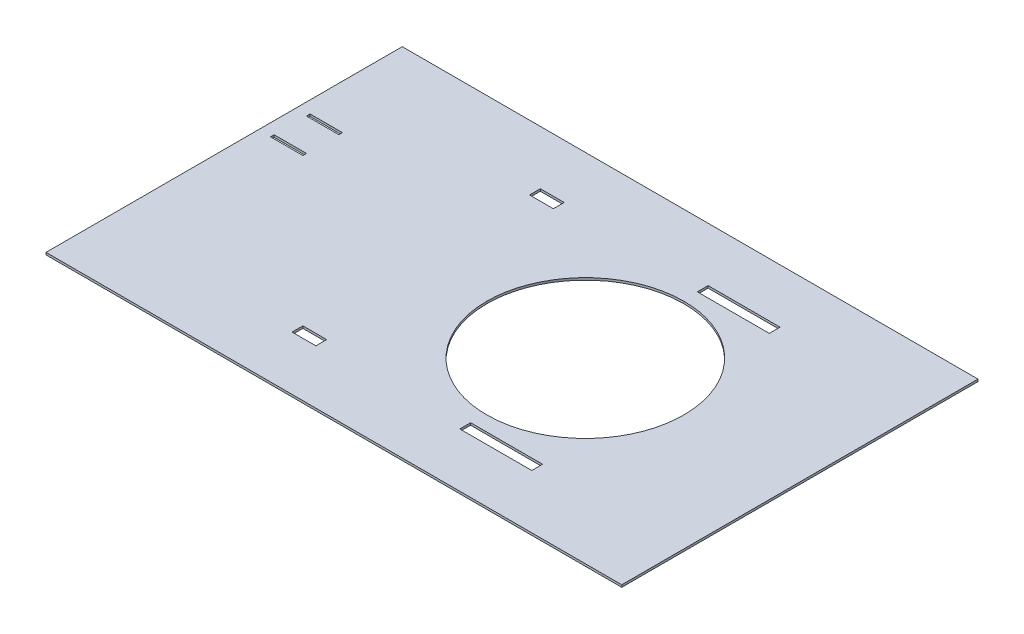
ISO-10303-21;
HEADER;
FILE_DESCRIPTION(('STEP AP214'),'2;1');
FILE_NAME('part.step','',(''),(''),'','','');
FILE_SCHEMA(('AUTOMOTIVE_DESIGN { 1 0 10303 214 1 1 1 1 }'));
ENDSEC;
DATA;
#1=APPLICATION_CONTEXT('core data for automotive mechanical design processes');
#2=APPLICATION_PROTOCOL_DEFINITION('international standard','automotive_design',2000,#1);
#3=PRODUCT_CONTEXT('',#1,'mechanical');
#4=PRODUCT('Part','Part','',(#3));
#5=PRODUCT_RELATED_PRODUCT_CATEGORY('part','',(#4));
#6=PRODUCT_DEFINITION_FORMATION('','',#4);
#7=PRODUCT_DEFINITION_CONTEXT('part definition',#1,'design');
#8=PRODUCT_DEFINITION('design','',#6,#7);
#9=PRODUCT_DEFINITION_SHAPE('','',#8);
#10=(LENGTH_UNIT() NAMED_UNIT(*) SI_UNIT(.MILLI.,.METRE.));
#11=(NAMED_UNIT(*) PLANE_ANGLE_UNIT() SI_UNIT($,.RADIAN.));
#12=(NAMED_UNIT(*) SI_UNIT($,.STERADIAN.) SOLID_ANGLE_UNIT());
#13=UNCERTAINTY_MEASURE_WITH_UNIT(LENGTH_MEASURE(1.E-05),#10,'distance_accuracy_value','');
#14=(GEOMETRIC_REPRESENTATION_CONTEXT(3) GLOBAL_UNCERTAINTY_ASSIGNED_CONTEXT((#13)) GLOBAL_UNIT_ASSIGNED_CONTEXT((#10,
#11,#12)) REPRESENTATION_CONTEXT('',''));
#15=CARTESIAN_POINT('',(0.,0.,0.));
#16=DIRECTION('',(0.,0.,1.));
#17=DIRECTION('',(1.,0.,0.));
#18=AXIS2_PLACEMENT_3D('',#15,#16,#17);
#19=CARTESIAN_POINT('',(0.,3.,0.));
#20=DIRECTION('',(0.,1.,0.));
#21=DIRECTION('',(0.,0.,1.));
#22=AXIS2_PLACEMENT_3D('',#19,#20,#21);
#23=PLANE('',#22);
#24=DIRECTION('',(1.,0.,0.));
#25=VECTOR('',#24,1.);
#26=CARTESIAN_POINT('',(-387.20375,3.,239.5806));
#27=LINE('',#26,#25);
#28=CARTESIAN_POINT('',(-387.20375,3.,239.5806));
#29=VERTEX_POINT('',#28);
#30=CARTESIAN_POINT('',(387.20375,3.,239.5806));
#31=VERTEX_POINT('',#30);
#32=EDGE_CURVE('E502',#29,#31,#27,.T.);
#33=ORIENTED_EDGE('',*,*,#32,.T.);
#34=DIRECTION('',(0.,0.,-1.));
#35=VECTOR('',#34,1.);
#36=CARTESIAN_POINT('',(387.20375,3.,239.5806));
#37=LINE('',#36,#35);
#38=CARTESIAN_POINT('',(387.20375,3.,-239.5806));
#39=VERTEX_POINT('',#38);
#40=EDGE_CURVE('E515',#31,#39,#37,.T.);
#41=ORIENTED_EDGE('',*,*,#40,.T.);
#42=DIRECTION('',(-1.,0.,0.));
#43=VECTOR('',#42,1.);
#44=CARTESIAN_POINT('',(387.20375,3.,-239.5806));
#45=LINE('',#44,#43);
#46=CARTESIAN_POINT('',(-387.20375,3.,-239.5806));
#47=VERTEX_POINT('',#46);
#48=EDGE_CURVE('E496',#39,#47,#45,.T.);
#49=ORIENTED_EDGE('',*,*,#48,.T.);
#50=DIRECTION('',(0.,0.,1.));
#51=VECTOR('',#50,1.);
#52=CARTESIAN_POINT('',(-387.20375,3.,-239.5806));
#53=LINE('',#52,#51);
#54=EDGE_CURVE('E509',#47,#29,#53,.T.);
#55=ORIENTED_EDGE('',*,*,#54,.T.);
#56=EDGE_LOOP('',(#33,#41,#49,#55));
#57=FACE_BOUND('',#56,.T.);
#58=CARTESIAN_POINT('',(98.6407500000001,3.,-132.5042));
#59=CARTESIAN_POINT('',(25.46305,3.,-132.5043));
#60=CARTESIAN_POINT('',(-33.85925,3.,-73.1822));
#61=CARTESIAN_POINT('',(-33.8594499999999,3.,-0.00450000000001838));
#62=B_SPLINE_CURVE_WITH_KNOTS('',3,(#58,#59,#60,#61),.UNSPECIFIED.,.F.,.F.,(4,4),(0.2,0.4),.UNSPECIFIED.);
#63=CARTESIAN_POINT('',(98.6407500000001,3.,-132.5042));
#64=VERTEX_POINT('',#63);
#65=CARTESIAN_POINT('',(-33.8594499999999,3.,-0.00450000000001838));
#66=VERTEX_POINT('',#65);
#67=EDGE_CURVE('E444',#64,#66,#62,.T.);
#68=ORIENTED_EDGE('',*,*,#67,.F.);
#69=CARTESIAN_POINT('',(231.14055,3.,-0.00419999245820923));
#70=CARTESIAN_POINT('',(231.14055,3.,-73.1819));
#71=CARTESIAN_POINT('',(171.81845,3.,-132.5041));
#72=CARTESIAN_POINT('',(98.6407500000001,3.,-132.5042));
#73=B_SPLINE_CURVE_WITH_KNOTS('',3,(#69,#70,#71,#72),.UNSPECIFIED.,.F.,.F.,(4,4),(0.,0.2),.UNSPECIFIED.);
#74=CARTESIAN_POINT('',(231.14055,3.,-0.00419999245820923));
#75=VERTEX_POINT('',#74);
#76=EDGE_CURVE('E439',#75,#64,#73,.T.);
#77=ORIENTED_EDGE('',*,*,#76,.F.);
#78=DIRECTION('',(0.,0.,-1.));
#79=VECTOR('',#78,1.);
#80=CARTESIAN_POINT('',(231.14055,3.,-0.00350000377091764));
#81=LINE('',#80,#79);
#82=CARTESIAN_POINT('',(231.14055,3.,-0.00350000377091764));
#83=VERTEX_POINT('',#82);
#84=EDGE_CURVE('E660',#83,#75,#81,.T.);
#85=ORIENTED_EDGE('',*,*,#84,.F.);
#86=CARTESIAN_POINT('',(98.6400500000001,3.,132.4958));
#87=CARTESIAN_POINT('',(171.81775,3.,132.4961));
#88=CARTESIAN_POINT('',(231.14015,3.,73.1742));
#89=CARTESIAN_POINT('',(231.14055,3.,-0.00350000377091764));
#90=B_SPLINE_CURVE_WITH_KNOTS('',3,(#86,#87,#88,#89),.UNSPECIFIED.,.F.,.F.,(4,4),(0.6,1.),.UNSPECIFIED.);
#91=CARTESIAN_POINT('',(98.6400500000001,3.,132.4958));
#92=VERTEX_POINT('',#91);
#93=EDGE_CURVE('E654',#92,#83,#90,.T.);
#94=ORIENTED_EDGE('',*,*,#93,.F.);
#95=CARTESIAN_POINT('',(-33.8594499999999,3.,-0.00450000000001838));
#96=CARTESIAN_POINT('',(-33.85965,3.,73.1731));
#97=CARTESIAN_POINT('',(25.46235,3.,132.4955));
#98=CARTESIAN_POINT('',(98.6400500000001,3.,132.4958));
#99=B_SPLINE_CURVE_WITH_KNOTS('',3,(#95,#96,#97,#98),.UNSPECIFIED.,.F.,.F.,(4,4),(0.4,0.6),.UNSPECIFIED.);
#100=EDGE_CURVE('E661',#66,#92,#99,.T.);
#101=ORIENTED_EDGE('',*,*,#100,.F.);
#102=EDGE_LOOP('',(#68,#77,#85,#94,#101));
#103=FACE_BOUND('',#102,.T.);
#104=DIRECTION('',(0.,0.,1.));
#105=VECTOR('',#104,1.);
#106=CARTESIAN_POINT('',(96.80135,3.,152.4554));
#107=LINE('',#106,#105);
#108=CARTESIAN_POINT('',(96.80135,3.,152.4554));
#109=VERTEX_POINT('',#108);
#110=CARTESIAN_POINT('',(96.80135,3.,166.9771));
#111=VERTEX_POINT('',#110);
#112=EDGE_CURVE('E410',#109,#111,#107,.T.);
#113=ORIENTED_EDGE('',*,*,#112,.F.);
#114=DIRECTION('',(-1.,0.,0.));
#115=VECTOR('',#114,1.);
#116=CARTESIAN_POINT('',(193.60275,3.,152.4554));
#117=LINE('',#116,#115);
#118=CARTESIAN_POINT('',(193.60275,3.,152.4554));
#119=VERTEX_POINT('',#118);
#120=EDGE_CURVE('E408',#119,#109,#117,.T.);
#121=ORIENTED_EDGE('',*,*,#120,.F.);
#122=DIRECTION('',(0.,0.,-1.));
#123=VECTOR('',#122,1.);
#124=CARTESIAN_POINT('',(193.60275,3.,166.9771));
#125=LINE('',#124,#123);
#126=CARTESIAN_POINT('',(193.60275,3.,166.9771));
#127=VERTEX_POINT('',#126);
#128=EDGE_CURVE('E416',#127,#119,#125,.T.);
#129=ORIENTED_EDGE('',*,*,#128,.F.);
#130=DIRECTION('',(1.,0.,0.));
#131=VECTOR('',#130,1.);
#132=CARTESIAN_POINT('',(96.80135,3.,166.9771));
#133=LINE('',#132,#131);
#134=EDGE_CURVE('E413',#111,#127,#133,.T.);
#135=ORIENTED_EDGE('',*,*,#134,.F.);
#136=EDGE_LOOP('',(#113,#121,#129,#135));
#137=FACE_BOUND('',#136,.T.);
#138=DIRECTION('',(0.,0.,1.));
#139=VECTOR('',#138,1.);
#140=CARTESIAN_POINT('',(-128.84775,3.,-166.9804));
#141=LINE('',#140,#139);
#142=CARTESIAN_POINT('',(-128.84775,3.,-166.9804));
#143=VERTEX_POINT('',#142);
#144=CARTESIAN_POINT('',(-128.84775,3.,-152.4587));
#145=VERTEX_POINT('',#144);
#146=EDGE_CURVE('E379',#143,#145,#141,.T.);
#147=ORIENTED_EDGE('',*,*,#146,.F.);
#148=DIRECTION('',(-1.,0.,0.));
#149=VECTOR('',#148,1.);
#150=CARTESIAN_POINT('',(-96.8046499999999,3.,-166.9804));
#151=LINE('',#150,#149);
#152=CARTESIAN_POINT('',(-96.8046499999999,3.,-166.9804));
#153=VERTEX_POINT('',#152);
#154=EDGE_CURVE('E377',#153,#143,#151,.T.);
#155=ORIENTED_EDGE('',*,*,#154,.F.);
#156=DIRECTION('',(0.,0.,-1.));
#157=VECTOR('',#156,1.);
#158=CARTESIAN_POINT('',(-96.8046499999999,3.,-152.4587));
#159=LINE('',#158,#157);
#160=CARTESIAN_POINT('',(-96.8046499999999,3.,-152.4587));
#161=VERTEX_POINT('',#160);
#162=EDGE_CURVE('E385',#161,#153,#159,.T.);
#163=ORIENTED_EDGE('',*,*,#162,.F.);
#164=DIRECTION('',(1.,0.,0.));
#165=VECTOR('',#164,1.);
#166=CARTESIAN_POINT('',(-128.84775,3.,-152.4587));
#167=LINE('',#166,#165);
#168=EDGE_CURVE('E382',#145,#161,#167,.T.);
#169=ORIENTED_EDGE('',*,*,#168,.F.);
#170=EDGE_LOOP('',(#147,#155,#163,#169));
#171=FACE_BOUND('',#170,.T.);
#172=DIRECTION('',(0.,0.,1.));
#173=VECTOR('',#172,1.);
#174=CARTESIAN_POINT('',(-128.84775,3.,152.4554));
#175=LINE('',#174,#173);
#176=CARTESIAN_POINT('',(-128.84775,3.,152.4554));
#177=VERTEX_POINT('',#176);
#178=CARTESIAN_POINT('',(-128.84775,3.,166.9771));
#179=VERTEX_POINT('',#178);
#180=EDGE_CURVE('E348',#177,#179,#175,.T.);
#181=ORIENTED_EDGE('',*,*,#180,.F.);
#182=DIRECTION('',(-1.,0.,0.));
#183=VECTOR('',#182,1.);
#184=CARTESIAN_POINT('',(-96.8046499999999,3.,152.4554));
#185=LINE('',#184,#183);
#186=CARTESIAN_POINT('',(-96.8046499999999,3.,152.4554));
#187=VERTEX_POINT('',#186);
#188=EDGE_CURVE('E346',#187,#177,#185,.T.);
#189=ORIENTED_EDGE('',*,*,#188,.F.);
#190=DIRECTION('',(0.,0.,-1.));
#191=VECTOR('',#190,1.);
#192=CARTESIAN_POINT('',(-96.8046499999999,3.,166.9771));
#193=LINE('',#192,#191);
#194=CARTESIAN_POINT('',(-96.8046499999999,3.,166.9771));
#195=VERTEX_POINT('',#194);
#196=EDGE_CURVE('E354',#195,#187,#193,.T.);
#197=ORIENTED_EDGE('',*,*,#196,.F.);
#198=DIRECTION('',(1.,0.,0.));
#199=VECTOR('',#198,1.);
#200=CARTESIAN_POINT('',(-128.84775,3.,166.9771));
#201=LINE('',#200,#199);
#202=EDGE_CURVE('E351',#179,#195,#201,.T.);
#203=ORIENTED_EDGE('',*,*,#202,.F.);
#204=EDGE_LOOP('',(#181,#189,#197,#203));
#205=FACE_BOUND('',#204,.T.);
#206=DIRECTION('',(0.,0.,1.));
#207=VECTOR('',#206,1.);
#208=CARTESIAN_POINT('',(-370.84615,3.,-99.2292));
#209=LINE('',#208,#207);
#210=CARTESIAN_POINT('',(-370.84615,3.,-99.2292));
#211=VERTEX_POINT('',#210);
#212=CARTESIAN_POINT('',(-370.84615,3.,-94.3886));
#213=VERTEX_POINT('',#212);
#214=EDGE_CURVE('E317',#211,#213,#209,.T.);
#215=ORIENTED_EDGE('',*,*,#214,.F.);
#216=DIRECTION('',(-1.,0.,0.));
#217=VECTOR('',#216,1.);
#218=CARTESIAN_POINT('',(-327.28105,3.,-99.2292));
#219=LINE('',#218,#217);
#220=CARTESIAN_POINT('',(-327.28105,3.,-99.2292));
#221=VERTEX_POINT('',#220);
#222=EDGE_CURVE('E315',#221,#211,#219,.T.);
#223=ORIENTED_EDGE('',*,*,#222,.F.);
#224=DIRECTION('',(0.,0.,-1.));
#225=VECTOR('',#224,1.);
#226=CARTESIAN_POINT('',(-327.28105,3.,-94.3886));
#227=LINE('',#226,#225);
#228=CARTESIAN_POINT('',(-327.28105,3.,-94.3886));
#229=VERTEX_POINT('',#228);
#230=EDGE_CURVE('E323',#229,#221,#227,.T.);
#231=ORIENTED_EDGE('',*,*,#230,.F.);
#232=DIRECTION('',(1.,0.,0.));
#233=VECTOR('',#232,1.);
#234=CARTESIAN_POINT('',(-370.84615,3.,-94.3886));
#235=LINE('',#234,#233);
#236=EDGE_CURVE('E320',#213,#229,#235,.T.);
#237=ORIENTED_EDGE('',*,*,#236,.F.);
#238=EDGE_LOOP('',(#215,#223,#231,#237));
#239=FACE_BOUND('',#238,.T.);
#240=DIRECTION('',(0.,0.,1.));
#241=VECTOR('',#240,1.);
#242=CARTESIAN_POINT('',(-370.84615,3.,-50.8235));
#243=LINE('',#242,#241);
#244=CARTESIAN_POINT('',(-370.84615,3.,-50.8235));
#245=VERTEX_POINT('',#244);
#246=CARTESIAN_POINT('',(-370.84615,3.,-45.9796));
#247=VERTEX_POINT('',#246);
#248=EDGE_CURVE('E286',#245,#247,#243,.T.);
#249=ORIENTED_EDGE('',*,*,#248,.F.);
#250=DIRECTION('',(-1.,0.,0.));
#251=VECTOR('',#250,1.);
#252=CARTESIAN_POINT('',(-327.28105,3.,-50.8235));
#253=LINE('',#252,#251);
#254=CARTESIAN_POINT('',(-327.28105,3.,-50.8235));
#255=VERTEX_POINT('',#254);
#256=EDGE_CURVE('E284',#255,#245,#253,.T.);
#257=ORIENTED_EDGE('',*,*,#256,.F.);
#258=DIRECTION('',(0.,0.,-1.));
#259=VECTOR('',#258,1.);
#260=CARTESIAN_POINT('',(-327.28105,3.,-45.9796));
#261=LINE('',#260,#259);
#262=CARTESIAN_POINT('',(-327.28105,3.,-45.9796));
#263=VERTEX_POINT('',#262);
#264=EDGE_CURVE('E292',#263,#255,#261,.T.);
#265=ORIENTED_EDGE('',*,*,#264,.F.);
#266=DIRECTION('',(1.,0.,0.));
#267=VECTOR('',#266,1.);
#268=CARTESIAN_POINT('',(-370.84615,3.,-45.9796));
#269=LINE('',#268,#267);
#270=EDGE_CURVE('E289',#247,#263,#269,.T.);
#271=ORIENTED_EDGE('',*,*,#270,.F.);
#272=EDGE_LOOP('',(#249,#257,#265,#271));
#273=FACE_BOUND('',#272,.T.);
#274=DIRECTION('',(0.,0.,-1.));
#275=VECTOR('',#274,1.);
#276=CARTESIAN_POINT('',(193.59605,3.,-152.4587));
#277=LINE('',#276,#275);
#278=CARTESIAN_POINT('',(193.59605,3.,-152.4587));
#279=VERTEX_POINT('',#278);
#280=CARTESIAN_POINT('',(193.59605,3.,-166.9804));
#281=VERTEX_POINT('',#280);
#282=EDGE_CURVE('E256',#279,#281,#277,.T.);
#283=ORIENTED_EDGE('',*,*,#282,.F.);
#284=DIRECTION('',(1.,0.,0.));
#285=VECTOR('',#284,1.);
#286=CARTESIAN_POINT('',(96.7963500000001,3.,-152.4587));
#287=LINE('',#286,#285);
#288=CARTESIAN_POINT('',(96.7963500000001,3.,-152.4587));
#289=VERTEX_POINT('',#288);
#290=EDGE_CURVE('E248',#289,#279,#287,.T.);
#291=ORIENTED_EDGE('',*,*,#290,.F.);
#292=DIRECTION('',(0.,0.,1.));
#293=VECTOR('',#292,1.);
#294=CARTESIAN_POINT('',(96.7963500000001,3.,-166.9804));
#295=LINE('',#294,#293);
#296=CARTESIAN_POINT('',(96.7963500000001,3.,-166.9804));
#297=VERTEX_POINT('',#296);
#298=EDGE_CURVE('E270',#297,#289,#295,.T.);
#299=ORIENTED_EDGE('',*,*,#298,.F.);
#300=DIRECTION('',(-1.,0.,0.));
#301=VECTOR('',#300,1.);
#302=CARTESIAN_POINT('',(193.59605,3.,-166.9804));
#303=LINE('',#302,#301);
#304=EDGE_CURVE('E268',#281,#297,#303,.T.);
#305=ORIENTED_EDGE('',*,*,#304,.F.);
#306=EDGE_LOOP('',(#283,#291,#299,#305));
#307=FACE_BOUND('',#306,.T.);
#308=ADVANCED_FACE('F33',(#57,#103,#137,#171,#205,#239,#273,#307),#23,.T.);
#309=CARTESIAN_POINT('',(0.,0.,0.));
#310=DIRECTION('',(0.,1.,0.));
#311=DIRECTION('',(0.,0.,1.));
#312=AXIS2_PLACEMENT_3D('',#309,#310,#311);
#313=PLANE('',#312);
#314=DIRECTION('',(-1.,0.,0.));
#315=VECTOR('',#314,1.);
#316=CARTESIAN_POINT('',(-327.28105,0.,-50.8235));
#317=LINE('',#316,#315);
#318=CARTESIAN_POINT('',(-327.28105,0.,-50.8235));
#319=VERTEX_POINT('',#318);
#320=CARTESIAN_POINT('',(-370.84615,0.,-50.8235));
#321=VERTEX_POINT('',#320);
#322=EDGE_CURVE('E264',#319,#321,#317,.T.);
#323=ORIENTED_EDGE('',*,*,#322,.T.);
#324=DIRECTION('',(0.,0.,1.));
#325=VECTOR('',#324,1.);
#326=CARTESIAN_POINT('',(-370.84615,0.,-50.8235));
#327=LINE('',#326,#325);
#328=CARTESIAN_POINT('',(-370.84615,0.,-45.9796));
#329=VERTEX_POINT('',#328);
#330=EDGE_CURVE('E297',#321,#329,#327,.T.);
#331=ORIENTED_EDGE('',*,*,#330,.T.);
#332=DIRECTION('',(1.,0.,0.));
#333=VECTOR('',#332,1.);
#334=CARTESIAN_POINT('',(-370.84615,0.,-45.9796));
#335=LINE('',#334,#333);
#336=CARTESIAN_POINT('',(-327.28105,0.,-45.9796));
#337=VERTEX_POINT('',#336);
#338=EDGE_CURVE('E300',#329,#337,#335,.T.);
#339=ORIENTED_EDGE('',*,*,#338,.T.);
#340=DIRECTION('',(0.,0.,-1.));
#341=VECTOR('',#340,1.);
#342=CARTESIAN_POINT('',(-327.28105,0.,-45.9796));
#343=LINE('',#342,#341);
#344=EDGE_CURVE('E287',#337,#319,#343,.T.);
#345=ORIENTED_EDGE('',*,*,#344,.T.);
#346=EDGE_LOOP('',(#323,#331,#339,#345));
#347=FACE_BOUND('',#346,.T.);
#348=DIRECTION('',(-1.,0.,0.));
#349=VECTOR('',#348,1.);
#350=CARTESIAN_POINT('',(-96.8046499999999,0.,152.4554));
#351=LINE('',#350,#349);
#352=CARTESIAN_POINT('',(-96.8046499999999,0.,152.4554));
#353=VERTEX_POINT('',#352);
#354=CARTESIAN_POINT('',(-128.84775,0.,152.4554));
#355=VERTEX_POINT('',#354);
#356=EDGE_CURVE('E345',#353,#355,#351,.T.);
#357=ORIENTED_EDGE('',*,*,#356,.T.);
#358=DIRECTION('',(0.,0.,1.));
#359=VECTOR('',#358,1.);
#360=CARTESIAN_POINT('',(-128.84775,0.,152.4554));
#361=LINE('',#360,#359);
#362=CARTESIAN_POINT('',(-128.84775,0.,166.9771));
#363=VERTEX_POINT('',#362);
#364=EDGE_CURVE('E359',#355,#363,#361,.T.);
#365=ORIENTED_EDGE('',*,*,#364,.T.);
#366=DIRECTION('',(1.,0.,0.));
#367=VECTOR('',#366,1.);
#368=CARTESIAN_POINT('',(-128.84775,0.,166.9771));
#369=LINE('',#368,#367);
#370=CARTESIAN_POINT('',(-96.8046499999999,0.,166.9771));
#371=VERTEX_POINT('',#370);
#372=EDGE_CURVE('E362',#363,#371,#369,.T.);
#373=ORIENTED_EDGE('',*,*,#372,.T.);
#374=DIRECTION('',(0.,0.,-1.));
#375=VECTOR('',#374,1.);
#376=CARTESIAN_POINT('',(-96.8046499999999,0.,166.9771));
#377=LINE('',#376,#375);
#378=EDGE_CURVE('E349',#371,#353,#377,.T.);
#379=ORIENTED_EDGE('',*,*,#378,.T.);
#380=EDGE_LOOP('',(#357,#365,#373,#379));
#381=FACE_BOUND('',#380,.T.);
#382=DIRECTION('',(-1.,0.,0.));
#383=VECTOR('',#382,1.);
#384=CARTESIAN_POINT('',(193.60275,0.,152.4554));
#385=LINE('',#384,#383);
#386=CARTESIAN_POINT('',(193.60275,0.,152.4554));
#387=VERTEX_POINT('',#386);
#388=CARTESIAN_POINT('',(96.80135,0.,152.4554));
#389=VERTEX_POINT('',#388);
#390=EDGE_CURVE('E407',#387,#389,#385,.T.);
#391=ORIENTED_EDGE('',*,*,#390,.T.);
#392=DIRECTION('',(0.,0.,1.));
#393=VECTOR('',#392,1.);
#394=CARTESIAN_POINT('',(96.80135,0.,152.4554));
#395=LINE('',#394,#393);
#396=CARTESIAN_POINT('',(96.80135,0.,166.9771));
#397=VERTEX_POINT('',#396);
#398=EDGE_CURVE('E421',#389,#397,#395,.T.);
#399=ORIENTED_EDGE('',*,*,#398,.T.);
#400=DIRECTION('',(1.,0.,0.));
#401=VECTOR('',#400,1.);
#402=CARTESIAN_POINT('',(96.80135,0.,166.9771));
#403=LINE('',#402,#401);
#404=CARTESIAN_POINT('',(193.60275,0.,166.9771));
#405=VERTEX_POINT('',#404);
#406=EDGE_CURVE('E424',#397,#405,#403,.T.);
#407=ORIENTED_EDGE('',*,*,#406,.T.);
#408=DIRECTION('',(0.,0.,-1.));
#409=VECTOR('',#408,1.);
#410=CARTESIAN_POINT('',(193.60275,0.,166.9771));
#411=LINE('',#410,#409);
#412=EDGE_CURVE('E411',#405,#387,#411,.T.);
#413=ORIENTED_EDGE('',*,*,#412,.T.);
#414=EDGE_LOOP('',(#391,#399,#407,#413));
#415=FACE_BOUND('',#414,.T.);
#416=DIRECTION('',(1.,0.,0.));
#417=VECTOR('',#416,1.);
#418=CARTESIAN_POINT('',(-387.20375,0.,239.5806));
#419=LINE('',#418,#417);
#420=CARTESIAN_POINT('',(-387.20375,0.,239.5806));
#421=VERTEX_POINT('',#420);
#422=CARTESIAN_POINT('',(387.20375,0.,239.5806));
#423=VERTEX_POINT('',#422);
#424=EDGE_CURVE('E492',#421,#423,#419,.T.);
#425=ORIENTED_EDGE('',*,*,#424,.F.);
#426=DIRECTION('',(0.,0.,1.));
#427=VECTOR('',#426,1.);
#428=CARTESIAN_POINT('',(-387.20375,0.,-239.5806));
#429=LINE('',#428,#427);
#430=CARTESIAN_POINT('',(-387.20375,0.,-239.5806));
#431=VERTEX_POINT('',#430);
#432=EDGE_CURVE('E500',#431,#421,#429,.T.);
#433=ORIENTED_EDGE('',*,*,#432,.F.);
#434=DIRECTION('',(-1.,0.,0.));
#435=VECTOR('',#434,1.);
#436=CARTESIAN_POINT('',(387.20375,0.,-239.5806));
#437=LINE('',#436,#435);
#438=CARTESIAN_POINT('',(387.20375,0.,-239.5806));
#439=VERTEX_POINT('',#438);
#440=EDGE_CURVE('E491',#439,#431,#437,.T.);
#441=ORIENTED_EDGE('',*,*,#440,.F.);
#442=DIRECTION('',(0.,0.,-1.));
#443=VECTOR('',#442,1.);
#444=CARTESIAN_POINT('',(387.20375,0.,239.5806));
#445=LINE('',#444,#443);
#446=EDGE_CURVE('E483',#423,#439,#445,.T.);
#447=ORIENTED_EDGE('',*,*,#446,.F.);
#448=EDGE_LOOP('',(#425,#433,#441,#447));
#449=FACE_BOUND('',#448,.T.);
#450=CARTESIAN_POINT('',(231.14055,0.,-0.00419999245820923));
#451=CARTESIAN_POINT('',(231.14055,0.,-73.1819));
#452=CARTESIAN_POINT('',(171.81845,0.,-132.5041));
#453=CARTESIAN_POINT('',(98.6407500000001,0.,-132.5042));
#454=B_SPLINE_CURVE_WITH_KNOTS('',3,(#450,#451,#452,#453),.UNSPECIFIED.,.F.,.F.,(4,4),(0.,0.2),.UNSPECIFIED.);
#455=CARTESIAN_POINT('',(231.14055,0.,-0.00419999245820923));
#456=VERTEX_POINT('',#455);
#457=CARTESIAN_POINT('',(98.6407500000001,0.,-132.5042));
#458=VERTEX_POINT('',#457);
#459=EDGE_CURVE('E438',#456,#458,#454,.T.);
#460=ORIENTED_EDGE('',*,*,#459,.T.);
#461=CARTESIAN_POINT('',(98.6407500000001,0.,-132.5042));
#462=CARTESIAN_POINT('',(25.46305,0.,-132.5043));
#463=CARTESIAN_POINT('',(-33.85925,0.,-73.1822));
#464=CARTESIAN_POINT('',(-33.8594499999999,0.,-0.00450000000001838));
#465=B_SPLINE_CURVE_WITH_KNOTS('',3,(#461,#462,#463,#464),.UNSPECIFIED.,.F.,.F.,(4,4),(0.2,0.4),.UNSPECIFIED.);
#466=CARTESIAN_POINT('',(-33.8594499999999,0.,-0.00450000000001838));
#467=VERTEX_POINT('',#466);
#468=EDGE_CURVE('E673',#458,#467,#465,.T.);
#469=ORIENTED_EDGE('',*,*,#468,.T.);
#470=CARTESIAN_POINT('',(-33.8594499999999,0.,-0.00450000000001838));
#471=CARTESIAN_POINT('',(-33.85965,0.,73.1731));
#472=CARTESIAN_POINT('',(25.46235,0.,132.4955));
#473=CARTESIAN_POINT('',(98.6400500000001,0.,132.4958));
#474=B_SPLINE_CURVE_WITH_KNOTS('',3,(#470,#471,#472,#473),.UNSPECIFIED.,.F.,.F.,(4,4),(0.4,0.6),.UNSPECIFIED.);
#475=CARTESIAN_POINT('',(98.6400500000001,0.,132.4958));
#476=VERTEX_POINT('',#475);
#477=EDGE_CURVE('E681',#467,#476,#474,.T.);
#478=ORIENTED_EDGE('',*,*,#477,.T.);
#479=CARTESIAN_POINT('',(98.6400500000001,0.,132.4958));
#480=CARTESIAN_POINT('',(171.81775,0.,132.4961));
#481=CARTESIAN_POINT('',(231.14015,0.,73.1742));
#482=CARTESIAN_POINT('',(231.14055,0.,-0.00350000377091764));
#483=B_SPLINE_CURVE_WITH_KNOTS('',3,(#479,#480,#481,#482),.UNSPECIFIED.,.F.,.F.,(4,4),(0.6,1.),.UNSPECIFIED.);
#484=CARTESIAN_POINT('',(231.14055,0.,-0.00350000377091764));
#485=VERTEX_POINT('',#484);
#486=EDGE_CURVE('E689',#476,#485,#483,.T.);
#487=ORIENTED_EDGE('',*,*,#486,.T.);
#488=DIRECTION('',(0.,0.,-1.));
#489=VECTOR('',#488,1.);
#490=CARTESIAN_POINT('',(231.14055,0.,-0.00350000377091764));
#491=LINE('',#490,#489);
#492=EDGE_CURVE('E445',#485,#456,#491,.T.);
#493=ORIENTED_EDGE('',*,*,#492,.T.);
#494=EDGE_LOOP('',(#460,#469,#478,#487,#493));
#495=FACE_BOUND('',#494,.T.);
#496=DIRECTION('',(-1.,0.,0.));
#497=VECTOR('',#496,1.);
#498=CARTESIAN_POINT('',(-96.8046499999999,0.,-166.9804));
#499=LINE('',#498,#497);
#500=CARTESIAN_POINT('',(-96.8046499999999,0.,-166.9804));
#501=VERTEX_POINT('',#500);
#502=CARTESIAN_POINT('',(-128.84775,0.,-166.9804));
#503=VERTEX_POINT('',#502);
#504=EDGE_CURVE('E376',#501,#503,#499,.T.);
#505=ORIENTED_EDGE('',*,*,#504,.T.);
#506=DIRECTION('',(0.,0.,1.));
#507=VECTOR('',#506,1.);
#508=CARTESIAN_POINT('',(-128.84775,0.,-166.9804));
#509=LINE('',#508,#507);
#510=CARTESIAN_POINT('',(-128.84775,0.,-152.4587));
#511=VERTEX_POINT('',#510);
#512=EDGE_CURVE('E390',#503,#511,#509,.T.);
#513=ORIENTED_EDGE('',*,*,#512,.T.);
#514=DIRECTION('',(1.,0.,0.));
#515=VECTOR('',#514,1.);
#516=CARTESIAN_POINT('',(-128.84775,0.,-152.4587));
#517=LINE('',#516,#515);
#518=CARTESIAN_POINT('',(-96.8046499999999,0.,-152.4587));
#519=VERTEX_POINT('',#518);
#520=EDGE_CURVE('E393',#511,#519,#517,.T.);
#521=ORIENTED_EDGE('',*,*,#520,.T.);
#522=DIRECTION('',(0.,0.,-1.));
#523=VECTOR('',#522,1.);
#524=CARTESIAN_POINT('',(-96.8046499999999,0.,-152.4587));
#525=LINE('',#524,#523);
#526=EDGE_CURVE('E380',#519,#501,#525,.T.);
#527=ORIENTED_EDGE('',*,*,#526,.T.);
#528=EDGE_LOOP('',(#505,#513,#521,#527));
#529=FACE_BOUND('',#528,.T.);
#530=DIRECTION('',(-1.,0.,0.));
#531=VECTOR('',#530,1.);
#532=CARTESIAN_POINT('',(-327.28105,0.,-99.2292));
#533=LINE('',#532,#531);
#534=CARTESIAN_POINT('',(-327.28105,0.,-99.2292));
#535=VERTEX_POINT('',#534);
#536=CARTESIAN_POINT('',(-370.84615,0.,-99.2292));
#537=VERTEX_POINT('',#536);
#538=EDGE_CURVE('E314',#535,#537,#533,.T.);
#539=ORIENTED_EDGE('',*,*,#538,.T.);
#540=DIRECTION('',(0.,0.,1.));
#541=VECTOR('',#540,1.);
#542=CARTESIAN_POINT('',(-370.84615,0.,-99.2292));
#543=LINE('',#542,#541);
#544=CARTESIAN_POINT('',(-370.84615,0.,-94.3886));
#545=VERTEX_POINT('',#544);
#546=EDGE_CURVE('E328',#537,#545,#543,.T.);
#547=ORIENTED_EDGE('',*,*,#546,.T.);
#548=DIRECTION('',(1.,0.,0.));
#549=VECTOR('',#548,1.);
#550=CARTESIAN_POINT('',(-370.84615,0.,-94.3886));
#551=LINE('',#550,#549);
#552=CARTESIAN_POINT('',(-327.28105,0.,-94.3886));
#553=VERTEX_POINT('',#552);
#554=EDGE_CURVE('E331',#545,#553,#551,.T.);
#555=ORIENTED_EDGE('',*,*,#554,.T.);
#556=DIRECTION('',(0.,0.,-1.));
#557=VECTOR('',#556,1.);
#558=CARTESIAN_POINT('',(-327.28105,0.,-94.3886));
#559=LINE('',#558,#557);
#560=EDGE_CURVE('E318',#553,#535,#559,.T.);
#561=ORIENTED_EDGE('',*,*,#560,.T.);
#562=EDGE_LOOP('',(#539,#547,#555,#561));
#563=FACE_BOUND('',#562,.T.);
#564=DIRECTION('',(1.,0.,0.));
#565=VECTOR('',#564,1.);
#566=CARTESIAN_POINT('',(96.7963500000001,0.,-152.4587));
#567=LINE('',#566,#565);
#568=CARTESIAN_POINT('',(96.7963500000001,0.,-152.4587));
#569=VERTEX_POINT('',#568);
#570=CARTESIAN_POINT('',(193.59605,0.,-152.4587));
#571=VERTEX_POINT('',#570);
#572=EDGE_CURVE('E56',#569,#571,#567,.T.);
#573=ORIENTED_EDGE('',*,*,#572,.T.);
#574=DIRECTION('',(0.,0.,-1.));
#575=VECTOR('',#574,1.);
#576=CARTESIAN_POINT('',(193.59605,0.,-152.4587));
#577=LINE('',#576,#575);
#578=CARTESIAN_POINT('',(193.59605,0.,-166.9804));
#579=VERTEX_POINT('',#578);
#580=EDGE_CURVE('E263',#571,#579,#577,.T.);
#581=ORIENTED_EDGE('',*,*,#580,.T.);
#582=DIRECTION('',(-1.,0.,0.));
#583=VECTOR('',#582,1.);
#584=CARTESIAN_POINT('',(193.59605,0.,-166.9804));
#585=LINE('',#584,#583);
#586=CARTESIAN_POINT('',(96.7963500000001,0.,-166.9804));
#587=VERTEX_POINT('',#586);
#588=EDGE_CURVE('E276',#579,#587,#585,.T.);
#589=ORIENTED_EDGE('',*,*,#588,.T.);
#590=DIRECTION('',(0.,0.,1.));
#591=VECTOR('',#590,1.);
#592=CARTESIAN_POINT('',(96.7963500000001,0.,-166.9804));
#593=LINE('',#592,#591);
#594=EDGE_CURVE('E257',#587,#569,#593,.T.);
#595=ORIENTED_EDGE('',*,*,#594,.T.);
#596=EDGE_LOOP('',(#573,#581,#589,#595));
#597=FACE_BOUND('',#596,.T.);
#598=ADVANCED_FACE('F464',(#347,#381,#415,#449,#495,#529,#563,#597),#313,.F.);
#599=CARTESIAN_POINT('',(-387.20375,3.,239.5806));
#600=DIRECTION('',(0.,0.,-1.));
#601=DIRECTION('',(-1.,0.,0.));
#602=AXIS2_PLACEMENT_3D('',#599,#600,#601);
#603=PLANE('',#602);
#604=ORIENTED_EDGE('',*,*,#424,.T.);
#605=DIRECTION('',(0.,-1.,0.));
#606=VECTOR('',#605,1.);
#607=CARTESIAN_POINT('',(387.20375,3.,239.5806));
#608=LINE('',#607,#606);
#609=EDGE_CURVE('E11',#31,#423,#608,.T.);
#610=ORIENTED_EDGE('',*,*,#609,.F.);
#611=ORIENTED_EDGE('',*,*,#32,.F.);
#612=DIRECTION('',(0.,-1.,0.));
#613=VECTOR('',#612,1.);
#614=CARTESIAN_POINT('',(-387.20375,3.,239.5806));
#615=LINE('',#614,#613);
#616=EDGE_CURVE('E506',#29,#421,#615,.T.);
#617=ORIENTED_EDGE('',*,*,#616,.T.);
#618=EDGE_LOOP('',(#604,#610,#611,#617));
#619=FACE_BOUND('',#618,.T.);
#620=ADVANCED_FACE('F35',(#619),#603,.F.);
#621=CARTESIAN_POINT('',(387.20375,3.,239.5806));
#622=DIRECTION('',(-1.,0.,0.));
#623=DIRECTION('',(0.,0.,1.));
#624=AXIS2_PLACEMENT_3D('',#621,#622,#623);
#625=PLANE('',#624);
#626=ORIENTED_EDGE('',*,*,#446,.T.);
#627=DIRECTION('',(0.,-1.,0.));
#628=VECTOR('',#627,1.);
#629=CARTESIAN_POINT('',(387.20375,3.,-239.5806));
#630=LINE('',#629,#628);
#631=EDGE_CURVE('E41',#39,#439,#630,.T.);
#632=ORIENTED_EDGE('',*,*,#631,.F.);
#633=ORIENTED_EDGE('',*,*,#40,.F.);
#634=ORIENTED_EDGE('',*,*,#609,.T.);
#635=EDGE_LOOP('',(#626,#632,#633,#634));
#636=FACE_BOUND('',#635,.T.);
#637=ADVANCED_FACE('F474',(#636),#625,.F.);
#638=CARTESIAN_POINT('',(387.20375,3.,-239.5806));
#639=DIRECTION('',(0.,0.,1.));
#640=DIRECTION('',(1.,0.,0.));
#641=AXIS2_PLACEMENT_3D('',#638,#639,#640);
#642=PLANE('',#641);
#643=ORIENTED_EDGE('',*,*,#440,.T.);
#644=DIRECTION('',(0.,-1.,0.));
#645=VECTOR('',#644,1.);
#646=CARTESIAN_POINT('',(-387.20375,3.,-239.5806));
#647=LINE('',#646,#645);
#648=EDGE_CURVE('E497',#47,#431,#647,.T.);
#649=ORIENTED_EDGE('',*,*,#648,.F.);
#650=ORIENTED_EDGE('',*,*,#48,.F.);
#651=ORIENTED_EDGE('',*,*,#631,.T.);
#652=EDGE_LOOP('',(#643,#649,#650,#651));
#653=FACE_BOUND('',#652,.T.);
#654=ADVANCED_FACE('F471',(#653),#642,.F.);
#655=CARTESIAN_POINT('',(-387.20375,3.,-239.5806));
#656=DIRECTION('',(1.,0.,0.));
#657=DIRECTION('',(0.,0.,-1.));
#658=AXIS2_PLACEMENT_3D('',#655,#656,#657);
#659=PLANE('',#658);
#660=ORIENTED_EDGE('',*,*,#432,.T.);
#661=ORIENTED_EDGE('',*,*,#616,.F.);
#662=ORIENTED_EDGE('',*,*,#54,.F.);
#663=ORIENTED_EDGE('',*,*,#648,.T.);
#664=EDGE_LOOP('',(#660,#661,#662,#663));
#665=FACE_BOUND('',#664,.T.);
#666=ADVANCED_FACE('F459',(#665),#659,.F.);
#667=DIRECTION('',(0.,-1.,0.));
#668=VECTOR('',#667,1.);
#669=SURFACE_OF_LINEAR_EXTRUSION('',#73,#668);
#670=ORIENTED_EDGE('',*,*,#459,.F.);
#671=DIRECTION('',(0.,-1.,0.));
#672=VECTOR('',#671,1.);
#673=CARTESIAN_POINT('',(231.14055,3.,-0.00419999245820923));
#674=LINE('',#673,#672);
#675=EDGE_CURVE('E669',#75,#456,#674,.T.);
#676=ORIENTED_EDGE('',*,*,#675,.F.);
#677=ORIENTED_EDGE('',*,*,#76,.T.);
#678=DIRECTION('',(0.,-1.,0.));
#679=VECTOR('',#678,1.);
#680=CARTESIAN_POINT('',(98.6407500000001,3.,-132.5042));
#681=LINE('',#680,#679);
#682=EDGE_CURVE('E518',#64,#458,#681,.T.);
#683=ORIENTED_EDGE('',*,*,#682,.T.);
#684=EDGE_LOOP('',(#670,#676,#677,#683));
#685=FACE_BOUND('',#684,.T.);
#686=ADVANCED_FACE('F454',(#685),#669,.T.);
#687=DIRECTION('',(0.,-1.,0.));
#688=VECTOR('',#687,1.);
#689=SURFACE_OF_LINEAR_EXTRUSION('',#62,#688);
#690=ORIENTED_EDGE('',*,*,#468,.F.);
#691=ORIENTED_EDGE('',*,*,#682,.F.);
#692=ORIENTED_EDGE('',*,*,#67,.T.);
#693=DIRECTION('',(0.,-1.,0.));
#694=VECTOR('',#693,1.);
#695=CARTESIAN_POINT('',(-33.8594499999999,3.,-0.00450000000001838));
#696=LINE('',#695,#694);
#697=EDGE_CURVE('E520',#66,#467,#696,.T.);
#698=ORIENTED_EDGE('',*,*,#697,.T.);
#699=EDGE_LOOP('',(#690,#691,#692,#698));
#700=FACE_BOUND('',#699,.T.);
#701=ADVANCED_FACE('F458',(#700),#689,.T.);
#702=DIRECTION('',(0.,-1.,0.));
#703=VECTOR('',#702,1.);
#704=SURFACE_OF_LINEAR_EXTRUSION('',#99,#703);
#705=ORIENTED_EDGE('',*,*,#477,.F.);
#706=ORIENTED_EDGE('',*,*,#697,.F.);
#707=ORIENTED_EDGE('',*,*,#100,.T.);
#708=DIRECTION('',(0.,-1.,0.));
#709=VECTOR('',#708,1.);
#710=CARTESIAN_POINT('',(98.6400500000001,3.,132.4958));
#711=LINE('',#710,#709);
#712=EDGE_CURVE('E524',#92,#476,#711,.T.);
#713=ORIENTED_EDGE('',*,*,#712,.T.);
#714=EDGE_LOOP('',(#705,#706,#707,#713));
#715=FACE_BOUND('',#714,.T.);
#716=ADVANCED_FACE('F652',(#715),#704,.T.);
#717=DIRECTION('',(0.,-1.,0.));
#718=VECTOR('',#717,1.);
#719=SURFACE_OF_LINEAR_EXTRUSION('',#90,#718);
#720=ORIENTED_EDGE('',*,*,#486,.F.);
#721=ORIENTED_EDGE('',*,*,#712,.F.);
#722=ORIENTED_EDGE('',*,*,#93,.T.);
#723=DIRECTION('',(0.,-1.,0.));
#724=VECTOR('',#723,1.);
#725=CARTESIAN_POINT('',(231.14055,3.,-0.00350000377091764));
#726=LINE('',#725,#724);
#727=EDGE_CURVE('E704',#83,#485,#726,.T.);
#728=ORIENTED_EDGE('',*,*,#727,.T.);
#729=EDGE_LOOP('',(#720,#721,#722,#728));
#730=FACE_BOUND('',#729,.T.);
#731=ADVANCED_FACE('F648',(#730),#719,.T.);
#732=CARTESIAN_POINT('',(231.14055,3.,-0.00350000377091764));
#733=DIRECTION('',(-1.,0.,0.));
#734=DIRECTION('',(0.,0.,1.));
#735=AXIS2_PLACEMENT_3D('',#732,#733,#734);
#736=PLANE('',#735);
#737=ORIENTED_EDGE('',*,*,#492,.F.);
#738=ORIENTED_EDGE('',*,*,#727,.F.);
#739=ORIENTED_EDGE('',*,*,#84,.T.);
#740=ORIENTED_EDGE('',*,*,#675,.T.);
#741=EDGE_LOOP('',(#737,#738,#739,#740));
#742=FACE_BOUND('',#741,.T.);
#743=ADVANCED_FACE('F644',(#742),#736,.T.);
#744=CARTESIAN_POINT('',(193.60275,3.,152.4554));
#745=DIRECTION('',(0.,0.,1.));
#746=DIRECTION('',(1.,0.,0.));
#747=AXIS2_PLACEMENT_3D('',#744,#745,#746);
#748=PLANE('',#747);
#749=ORIENTED_EDGE('',*,*,#390,.F.);
#750=DIRECTION('',(0.,-1.,0.));
#751=VECTOR('',#750,1.);
#752=CARTESIAN_POINT('',(193.60275,3.,152.4554));
#753=LINE('',#752,#751);
#754=EDGE_CURVE('E418',#119,#387,#753,.T.);
#755=ORIENTED_EDGE('',*,*,#754,.F.);
#756=ORIENTED_EDGE('',*,*,#120,.T.);
#757=DIRECTION('',(0.,-1.,0.));
#758=VECTOR('',#757,1.);
#759=CARTESIAN_POINT('',(96.80135,3.,152.4554));
#760=LINE('',#759,#758);
#761=EDGE_CURVE('E435',#109,#389,#760,.T.);
#762=ORIENTED_EDGE('',*,*,#761,.T.);
#763=EDGE_LOOP('',(#749,#755,#756,#762));
#764=FACE_BOUND('',#763,.T.);
#765=ADVANCED_FACE('F640',(#764),#748,.T.);
#766=CARTESIAN_POINT('',(96.80135,3.,152.4554));
#767=DIRECTION('',(1.,0.,0.));
#768=DIRECTION('',(0.,0.,-1.));
#769=AXIS2_PLACEMENT_3D('',#766,#767,#768);
#770=PLANE('',#769);
#771=ORIENTED_EDGE('',*,*,#398,.F.);
#772=ORIENTED_EDGE('',*,*,#761,.F.);
#773=ORIENTED_EDGE('',*,*,#112,.T.);
#774=DIRECTION('',(0.,-1.,0.));
#775=VECTOR('',#774,1.);
#776=CARTESIAN_POINT('',(96.80135,3.,166.9771));
#777=LINE('',#776,#775);
#778=EDGE_CURVE('E433',#111,#397,#777,.T.);
#779=ORIENTED_EDGE('',*,*,#778,.T.);
#780=EDGE_LOOP('',(#771,#772,#773,#779));
#781=FACE_BOUND('',#780,.T.);
#782=ADVANCED_FACE('F636',(#781),#770,.T.);
#783=CARTESIAN_POINT('',(96.80135,3.,166.9771));
#784=DIRECTION('',(0.,0.,-1.));
#785=DIRECTION('',(-1.,0.,0.));
#786=AXIS2_PLACEMENT_3D('',#783,#784,#785);
#787=PLANE('',#786);
#788=ORIENTED_EDGE('',*,*,#406,.F.);
#789=ORIENTED_EDGE('',*,*,#778,.F.);
#790=ORIENTED_EDGE('',*,*,#134,.T.);
#791=DIRECTION('',(0.,-1.,0.));
#792=VECTOR('',#791,1.);
#793=CARTESIAN_POINT('',(193.60275,3.,166.9771));
#794=LINE('',#793,#792);
#795=EDGE_CURVE('E431',#127,#405,#794,.T.);
#796=ORIENTED_EDGE('',*,*,#795,.T.);
#797=EDGE_LOOP('',(#788,#789,#790,#796));
#798=FACE_BOUND('',#797,.T.);
#799=ADVANCED_FACE('F632',(#798),#787,.T.);
#800=CARTESIAN_POINT('',(193.60275,3.,166.9771));
#801=DIRECTION('',(-1.,0.,0.));
#802=DIRECTION('',(0.,0.,1.));
#803=AXIS2_PLACEMENT_3D('',#800,#801,#802);
#804=PLANE('',#803);
#805=ORIENTED_EDGE('',*,*,#412,.F.);
#806=ORIENTED_EDGE('',*,*,#795,.F.);
#807=ORIENTED_EDGE('',*,*,#128,.T.);
#808=ORIENTED_EDGE('',*,*,#754,.T.);
#809=EDGE_LOOP('',(#805,#806,#807,#808));
#810=FACE_BOUND('',#809,.T.);
#811=ADVANCED_FACE('F628',(#810),#804,.T.);
#812=CARTESIAN_POINT('',(-96.8046499999999,3.,-166.9804));
#813=DIRECTION('',(0.,0.,1.));
#814=DIRECTION('',(1.,0.,0.));
#815=AXIS2_PLACEMENT_3D('',#812,#813,#814);
#816=PLANE('',#815);
#817=ORIENTED_EDGE('',*,*,#504,.F.);
#818=DIRECTION('',(0.,-1.,0.));
#819=VECTOR('',#818,1.);
#820=CARTESIAN_POINT('',(-96.8046499999999,3.,-166.9804));
#821=LINE('',#820,#819);
#822=EDGE_CURVE('E387',#153,#501,#821,.T.);
#823=ORIENTED_EDGE('',*,*,#822,.F.);
#824=ORIENTED_EDGE('',*,*,#154,.T.);
#825=DIRECTION('',(0.,-1.,0.));
#826=VECTOR('',#825,1.);
#827=CARTESIAN_POINT('',(-128.84775,3.,-166.9804));
#828=LINE('',#827,#826);
#829=EDGE_CURVE('E404',#143,#503,#828,.T.);
#830=ORIENTED_EDGE('',*,*,#829,.T.);
#831=EDGE_LOOP('',(#817,#823,#824,#830));
#832=FACE_BOUND('',#831,.T.);
#833=ADVANCED_FACE('F624',(#832),#816,.T.);
#834=CARTESIAN_POINT('',(-128.84775,3.,-166.9804));
#835=DIRECTION('',(1.,0.,0.));
#836=DIRECTION('',(0.,0.,-1.));
#837=AXIS2_PLACEMENT_3D('',#834,#835,#836);
#838=PLANE('',#837);
#839=ORIENTED_EDGE('',*,*,#512,.F.);
#840=ORIENTED_EDGE('',*,*,#829,.F.);
#841=ORIENTED_EDGE('',*,*,#146,.T.);
#842=DIRECTION('',(0.,-1.,0.));
#843=VECTOR('',#842,1.);
#844=CARTESIAN_POINT('',(-128.84775,3.,-152.4587));
#845=LINE('',#844,#843);
#846=EDGE_CURVE('E402',#145,#511,#845,.T.);
#847=ORIENTED_EDGE('',*,*,#846,.T.);
#848=EDGE_LOOP('',(#839,#840,#841,#847));
#849=FACE_BOUND('',#848,.T.);
#850=ADVANCED_FACE('F620',(#849),#838,.T.);
#851=CARTESIAN_POINT('',(-128.84775,3.,-152.4587));
#852=DIRECTION('',(0.,0.,-1.));
#853=DIRECTION('',(-1.,0.,0.));
#854=AXIS2_PLACEMENT_3D('',#851,#852,#853);
#855=PLANE('',#854);
#856=ORIENTED_EDGE('',*,*,#520,.F.);
#857=ORIENTED_EDGE('',*,*,#846,.F.);
#858=ORIENTED_EDGE('',*,*,#168,.T.);
#859=DIRECTION('',(0.,-1.,0.));
#860=VECTOR('',#859,1.);
#861=CARTESIAN_POINT('',(-96.8046499999999,3.,-152.4587));
#862=LINE('',#861,#860);
#863=EDGE_CURVE('E400',#161,#519,#862,.T.);
#864=ORIENTED_EDGE('',*,*,#863,.T.);
#865=EDGE_LOOP('',(#856,#857,#858,#864));
#866=FACE_BOUND('',#865,.T.);
#867=ADVANCED_FACE('F616',(#866),#855,.T.);
#868=CARTESIAN_POINT('',(-96.8046499999999,3.,-152.4587));
#869=DIRECTION('',(-1.,0.,0.));
#870=DIRECTION('',(0.,0.,1.));
#871=AXIS2_PLACEMENT_3D('',#868,#869,#870);
#872=PLANE('',#871);
#873=ORIENTED_EDGE('',*,*,#526,.F.);
#874=ORIENTED_EDGE('',*,*,#863,.F.);
#875=ORIENTED_EDGE('',*,*,#162,.T.);
#876=ORIENTED_EDGE('',*,*,#822,.T.);
#877=EDGE_LOOP('',(#873,#874,#875,#876));
#878=FACE_BOUND('',#877,.T.);
#879=ADVANCED_FACE('F612',(#878),#872,.T.);
#880=CARTESIAN_POINT('',(-96.8046499999999,3.,152.4554));
#881=DIRECTION('',(0.,0.,1.));
#882=DIRECTION('',(1.,0.,0.));
#883=AXIS2_PLACEMENT_3D('',#880,#881,#882);
#884=PLANE('',#883);
#885=ORIENTED_EDGE('',*,*,#356,.F.);
#886=DIRECTION('',(0.,-1.,0.));
#887=VECTOR('',#886,1.);
#888=CARTESIAN_POINT('',(-96.8046499999999,3.,152.4554));
#889=LINE('',#888,#887);
#890=EDGE_CURVE('E356',#187,#353,#889,.T.);
#891=ORIENTED_EDGE('',*,*,#890,.F.);
#892=ORIENTED_EDGE('',*,*,#188,.T.);
#893=DIRECTION('',(0.,-1.,0.));
#894=VECTOR('',#893,1.);
#895=CARTESIAN_POINT('',(-128.84775,3.,152.4554));
#896=LINE('',#895,#894);
#897=EDGE_CURVE('E373',#177,#355,#896,.T.);
#898=ORIENTED_EDGE('',*,*,#897,.T.);
#899=EDGE_LOOP('',(#885,#891,#892,#898));
#900=FACE_BOUND('',#899,.T.);
#901=ADVANCED_FACE('F608',(#900),#884,.T.);
#902=CARTESIAN_POINT('',(-128.84775,3.,152.4554));
#903=DIRECTION('',(1.,0.,0.));
#904=DIRECTION('',(0.,0.,-1.));
#905=AXIS2_PLACEMENT_3D('',#902,#903,#904);
#906=PLANE('',#905);
#907=ORIENTED_EDGE('',*,*,#364,.F.);
#908=ORIENTED_EDGE('',*,*,#897,.F.);
#909=ORIENTED_EDGE('',*,*,#180,.T.);
#910=DIRECTION('',(0.,-1.,0.));
#911=VECTOR('',#910,1.);
#912=CARTESIAN_POINT('',(-128.84775,3.,166.9771));
#913=LINE('',#912,#911);
#914=EDGE_CURVE('E371',#179,#363,#913,.T.);
#915=ORIENTED_EDGE('',*,*,#914,.T.);
#916=EDGE_LOOP('',(#907,#908,#909,#915));
#917=FACE_BOUND('',#916,.T.);
#918=ADVANCED_FACE('F604',(#917),#906,.T.);
#919=CARTESIAN_POINT('',(-128.84775,3.,166.9771));
#920=DIRECTION('',(0.,0.,-1.));
#921=DIRECTION('',(-1.,0.,0.));
#922=AXIS2_PLACEMENT_3D('',#919,#920,#921);
#923=PLANE('',#922);
#924=ORIENTED_EDGE('',*,*,#372,.F.);
#925=ORIENTED_EDGE('',*,*,#914,.F.);
#926=ORIENTED_EDGE('',*,*,#202,.T.);
#927=DIRECTION('',(0.,-1.,0.));
#928=VECTOR('',#927,1.);
#929=CARTESIAN_POINT('',(-96.8046499999999,3.,166.9771));
#930=LINE('',#929,#928);
#931=EDGE_CURVE('E369',#195,#371,#930,.T.);
#932=ORIENTED_EDGE('',*,*,#931,.T.);
#933=EDGE_LOOP('',(#924,#925,#926,#932));
#934=FACE_BOUND('',#933,.T.);
#935=ADVANCED_FACE('F600',(#934),#923,.T.);
#936=CARTESIAN_POINT('',(-96.8046499999999,3.,166.9771));
#937=DIRECTION('',(-1.,0.,0.));
#938=DIRECTION('',(0.,0.,1.));
#939=AXIS2_PLACEMENT_3D('',#936,#937,#938);
#940=PLANE('',#939);
#941=ORIENTED_EDGE('',*,*,#378,.F.);
#942=ORIENTED_EDGE('',*,*,#931,.F.);
#943=ORIENTED_EDGE('',*,*,#196,.T.);
#944=ORIENTED_EDGE('',*,*,#890,.T.);
#945=EDGE_LOOP('',(#941,#942,#943,#944));
#946=FACE_BOUND('',#945,.T.);
#947=ADVANCED_FACE('F596',(#946),#940,.T.);
#948=CARTESIAN_POINT('',(-327.28105,3.,-99.2292));
#949=DIRECTION('',(0.,0.,1.));
#950=DIRECTION('',(1.,0.,0.));
#951=AXIS2_PLACEMENT_3D('',#948,#949,#950);
#952=PLANE('',#951);
#953=ORIENTED_EDGE('',*,*,#538,.F.);
#954=DIRECTION('',(0.,-1.,0.));
#955=VECTOR('',#954,1.);
#956=CARTESIAN_POINT('',(-327.28105,3.,-99.2292));
#957=LINE('',#956,#955);
#958=EDGE_CURVE('E325',#221,#535,#957,.T.);
#959=ORIENTED_EDGE('',*,*,#958,.F.);
#960=ORIENTED_EDGE('',*,*,#222,.T.);
#961=DIRECTION('',(0.,-1.,0.));
#962=VECTOR('',#961,1.);
#963=CARTESIAN_POINT('',(-370.84615,3.,-99.2292));
#964=LINE('',#963,#962);
#965=EDGE_CURVE('E342',#211,#537,#964,.T.);
#966=ORIENTED_EDGE('',*,*,#965,.T.);
#967=EDGE_LOOP('',(#953,#959,#960,#966));
#968=FACE_BOUND('',#967,.T.);
#969=ADVANCED_FACE('F592',(#968),#952,.T.);
#970=CARTESIAN_POINT('',(-370.84615,3.,-99.2292));
#971=DIRECTION('',(1.,0.,0.));
#972=DIRECTION('',(0.,0.,-1.));
#973=AXIS2_PLACEMENT_3D('',#970,#971,#972);
#974=PLANE('',#973);
#975=ORIENTED_EDGE('',*,*,#546,.F.);
#976=ORIENTED_EDGE('',*,*,#965,.F.);
#977=ORIENTED_EDGE('',*,*,#214,.T.);
#978=DIRECTION('',(0.,-1.,0.));
#979=VECTOR('',#978,1.);
#980=CARTESIAN_POINT('',(-370.84615,3.,-94.3886));
#981=LINE('',#980,#979);
#982=EDGE_CURVE('E340',#213,#545,#981,.T.);
#983=ORIENTED_EDGE('',*,*,#982,.T.);
#984=EDGE_LOOP('',(#975,#976,#977,#983));
#985=FACE_BOUND('',#984,.T.);
#986=ADVANCED_FACE('F588',(#985),#974,.T.);
#987=CARTESIAN_POINT('',(-370.84615,3.,-94.3886));
#988=DIRECTION('',(0.,0.,-1.));
#989=DIRECTION('',(-1.,0.,0.));
#990=AXIS2_PLACEMENT_3D('',#987,#988,#989);
#991=PLANE('',#990);
#992=ORIENTED_EDGE('',*,*,#554,.F.);
#993=ORIENTED_EDGE('',*,*,#982,.F.);
#994=ORIENTED_EDGE('',*,*,#236,.T.);
#995=DIRECTION('',(0.,-1.,0.));
#996=VECTOR('',#995,1.);
#997=CARTESIAN_POINT('',(-327.28105,3.,-94.3886));
#998=LINE('',#997,#996);
#999=EDGE_CURVE('E338',#229,#553,#998,.T.);
#1000=ORIENTED_EDGE('',*,*,#999,.T.);
#1001=EDGE_LOOP('',(#992,#993,#994,#1000));
#1002=FACE_BOUND('',#1001,.T.);
#1003=ADVANCED_FACE('F584',(#1002),#991,.T.);
#1004=CARTESIAN_POINT('',(-327.28105,3.,-94.3886));
#1005=DIRECTION('',(-1.,0.,0.));
#1006=DIRECTION('',(0.,0.,1.));
#1007=AXIS2_PLACEMENT_3D('',#1004,#1005,#1006);
#1008=PLANE('',#1007);
#1009=ORIENTED_EDGE('',*,*,#560,.F.);
#1010=ORIENTED_EDGE('',*,*,#999,.F.);
#1011=ORIENTED_EDGE('',*,*,#230,.T.);
#1012=ORIENTED_EDGE('',*,*,#958,.T.);
#1013=EDGE_LOOP('',(#1009,#1010,#1011,#1012));
#1014=FACE_BOUND('',#1013,.T.);
#1015=ADVANCED_FACE('F581',(#1014),#1008,.T.);
#1016=CARTESIAN_POINT('',(-327.28105,3.,-50.8235));
#1017=DIRECTION('',(0.,0.,1.));
#1018=DIRECTION('',(1.,0.,0.));
#1019=AXIS2_PLACEMENT_3D('',#1016,#1017,#1018);
#1020=PLANE('',#1019);
#1021=ORIENTED_EDGE('',*,*,#322,.F.);
#1022=DIRECTION('',(0.,-1.,0.));
#1023=VECTOR('',#1022,1.);
#1024=CARTESIAN_POINT('',(-327.28105,3.,-50.8235));
#1025=LINE('',#1024,#1023);
#1026=EDGE_CURVE('E294',#255,#319,#1025,.T.);
#1027=ORIENTED_EDGE('',*,*,#1026,.F.);
#1028=ORIENTED_EDGE('',*,*,#256,.T.);
#1029=DIRECTION('',(0.,-1.,0.));
#1030=VECTOR('',#1029,1.);
#1031=CARTESIAN_POINT('',(-370.84615,3.,-50.8235));
#1032=LINE('',#1031,#1030);
#1033=EDGE_CURVE('E311',#245,#321,#1032,.T.);
#1034=ORIENTED_EDGE('',*,*,#1033,.T.);
#1035=EDGE_LOOP('',(#1021,#1027,#1028,#1034));
#1036=FACE_BOUND('',#1035,.T.);
#1037=ADVANCED_FACE('F563',(#1036),#1020,.T.);
#1038=CARTESIAN_POINT('',(-370.84615,3.,-50.8235));
#1039=DIRECTION('',(1.,0.,0.));
#1040=DIRECTION('',(0.,0.,-1.));
#1041=AXIS2_PLACEMENT_3D('',#1038,#1039,#1040);
#1042=PLANE('',#1041);
#1043=ORIENTED_EDGE('',*,*,#330,.F.);
#1044=ORIENTED_EDGE('',*,*,#1033,.F.);
#1045=ORIENTED_EDGE('',*,*,#248,.T.);
#1046=DIRECTION('',(0.,-1.,0.));
#1047=VECTOR('',#1046,1.);
#1048=CARTESIAN_POINT('',(-370.84615,3.,-45.9796));
#1049=LINE('',#1048,#1047);
#1050=EDGE_CURVE('E309',#247,#329,#1049,.T.);
#1051=ORIENTED_EDGE('',*,*,#1050,.T.);
#1052=EDGE_LOOP('',(#1043,#1044,#1045,#1051));
#1053=FACE_BOUND('',#1052,.T.);
#1054=ADVANCED_FACE('F556',(#1053),#1042,.T.);
#1055=CARTESIAN_POINT('',(-370.84615,3.,-45.9796));
#1056=DIRECTION('',(0.,0.,-1.));
#1057=DIRECTION('',(-1.,0.,0.));
#1058=AXIS2_PLACEMENT_3D('',#1055,#1056,#1057);
#1059=PLANE('',#1058);
#1060=ORIENTED_EDGE('',*,*,#338,.F.);
#1061=ORIENTED_EDGE('',*,*,#1050,.F.);
#1062=ORIENTED_EDGE('',*,*,#270,.T.);
#1063=DIRECTION('',(0.,-1.,0.));
#1064=VECTOR('',#1063,1.);
#1065=CARTESIAN_POINT('',(-327.28105,3.,-45.9796));
#1066=LINE('',#1065,#1064);
#1067=EDGE_CURVE('E307',#263,#337,#1066,.T.);
#1068=ORIENTED_EDGE('',*,*,#1067,.T.);
#1069=EDGE_LOOP('',(#1060,#1061,#1062,#1068));
#1070=FACE_BOUND('',#1069,.T.);
#1071=ADVANCED_FACE('F559',(#1070),#1059,.T.);
#1072=CARTESIAN_POINT('',(-327.28105,3.,-45.9796));
#1073=DIRECTION('',(-1.,0.,0.));
#1074=DIRECTION('',(0.,0.,1.));
#1075=AXIS2_PLACEMENT_3D('',#1072,#1073,#1074);
#1076=PLANE('',#1075);
#1077=ORIENTED_EDGE('',*,*,#344,.F.);
#1078=ORIENTED_EDGE('',*,*,#1067,.F.);
#1079=ORIENTED_EDGE('',*,*,#264,.T.);
#1080=ORIENTED_EDGE('',*,*,#1026,.T.);
#1081=EDGE_LOOP('',(#1077,#1078,#1079,#1080));
#1082=FACE_BOUND('',#1081,.T.);
#1083=ADVANCED_FACE('F566',(#1082),#1076,.T.);
#1084=CARTESIAN_POINT('',(96.7963500000001,3.,-152.4587));
#1085=DIRECTION('',(0.,0.,-1.));
#1086=DIRECTION('',(-1.,0.,0.));
#1087=AXIS2_PLACEMENT_3D('',#1084,#1085,#1086);
#1088=PLANE('',#1087);
#1089=ORIENTED_EDGE('',*,*,#572,.F.);
#1090=DIRECTION('',(0.,-1.,0.));
#1091=VECTOR('',#1090,1.);
#1092=CARTESIAN_POINT('',(96.7963500000001,3.,-152.4587));
#1093=LINE('',#1092,#1091);
#1094=EDGE_CURVE('E252',#289,#569,#1093,.T.);
#1095=ORIENTED_EDGE('',*,*,#1094,.F.);
#1096=ORIENTED_EDGE('',*,*,#290,.T.);
#1097=DIRECTION('',(0.,-1.,0.));
#1098=VECTOR('',#1097,1.);
#1099=CARTESIAN_POINT('',(193.59605,3.,-152.4587));
#1100=LINE('',#1099,#1098);
#1101=EDGE_CURVE('E251',#279,#571,#1100,.T.);
#1102=ORIENTED_EDGE('',*,*,#1101,.T.);
#1103=EDGE_LOOP('',(#1089,#1095,#1096,#1102));
#1104=FACE_BOUND('',#1103,.T.);
#1105=ADVANCED_FACE('F250',(#1104),#1088,.T.);
#1106=CARTESIAN_POINT('',(193.59605,3.,-152.4587));
#1107=DIRECTION('',(-1.,0.,0.));
#1108=DIRECTION('',(0.,0.,1.));
#1109=AXIS2_PLACEMENT_3D('',#1106,#1107,#1108);
#1110=PLANE('',#1109);
#1111=ORIENTED_EDGE('',*,*,#580,.F.);
#1112=ORIENTED_EDGE('',*,*,#1101,.F.);
#1113=ORIENTED_EDGE('',*,*,#282,.T.);
#1114=DIRECTION('',(0.,-1.,0.));
#1115=VECTOR('',#1114,1.);
#1116=CARTESIAN_POINT('',(193.59605,3.,-166.9804));
#1117=LINE('',#1116,#1115);
#1118=EDGE_CURVE('E265',#281,#579,#1117,.T.);
#1119=ORIENTED_EDGE('',*,*,#1118,.T.);
#1120=EDGE_LOOP('',(#1111,#1112,#1113,#1119));
#1121=FACE_BOUND('',#1120,.T.);
#1122=ADVANCED_FACE('F260',(#1121),#1110,.T.);
#1123=CARTESIAN_POINT('',(193.59605,3.,-166.9804));
#1124=DIRECTION('',(0.,0.,1.));
#1125=DIRECTION('',(1.,0.,0.));
#1126=AXIS2_PLACEMENT_3D('',#1123,#1124,#1125);
#1127=PLANE('',#1126);
#1128=ORIENTED_EDGE('',*,*,#588,.F.);
#1129=ORIENTED_EDGE('',*,*,#1118,.F.);
#1130=ORIENTED_EDGE('',*,*,#304,.T.);
#1131=DIRECTION('',(0.,-1.,0.));
#1132=VECTOR('',#1131,1.);
#1133=CARTESIAN_POINT('',(96.7963500000001,3.,-166.9804));
#1134=LINE('',#1133,#1132);
#1135=EDGE_CURVE('E48',#297,#587,#1134,.T.);
#1136=ORIENTED_EDGE('',*,*,#1135,.T.);
#1137=EDGE_LOOP('',(#1128,#1129,#1130,#1136));
#1138=FACE_BOUND('',#1137,.T.);
#1139=ADVANCED_FACE('F825',(#1138),#1127,.T.);
#1140=CARTESIAN_POINT('',(96.7963500000001,3.,-166.9804));
#1141=DIRECTION('',(1.,0.,0.));
#1142=DIRECTION('',(0.,0.,-1.));
#1143=AXIS2_PLACEMENT_3D('',#1140,#1141,#1142);
#1144=PLANE('',#1143);
#1145=ORIENTED_EDGE('',*,*,#594,.F.);
#1146=ORIENTED_EDGE('',*,*,#1135,.F.);
#1147=ORIENTED_EDGE('',*,*,#298,.T.);
#1148=ORIENTED_EDGE('',*,*,#1094,.T.);
#1149=EDGE_LOOP('',(#1145,#1146,#1147,#1148));
#1150=FACE_BOUND('',#1149,.T.);
#1151=ADVANCED_FACE('F833',(#1150),#1144,.T.);
#1152=CLOSED_SHELL('',(#308,#598,#620,#637,#654,#666,#686,#701,#716,#731,#743,#765,#782,#799,
#811,#833,#850,#867,#879,#901,#918,#935,#947,#969,#986,#1003,#1015,#1037,#1054,#1071,#1083,
#1105,#1122,#1139,#1151));
#1153=MANIFOLD_SOLID_BREP('B2',#1152);
#1154=ADVANCED_BREP_SHAPE_REPRESENTATION('',(#18,#1153),#14);
#1155=SHAPE_DEFINITION_REPRESENTATION(#9,#1154);
ENDSEC;
END-ISO-10303-21;
